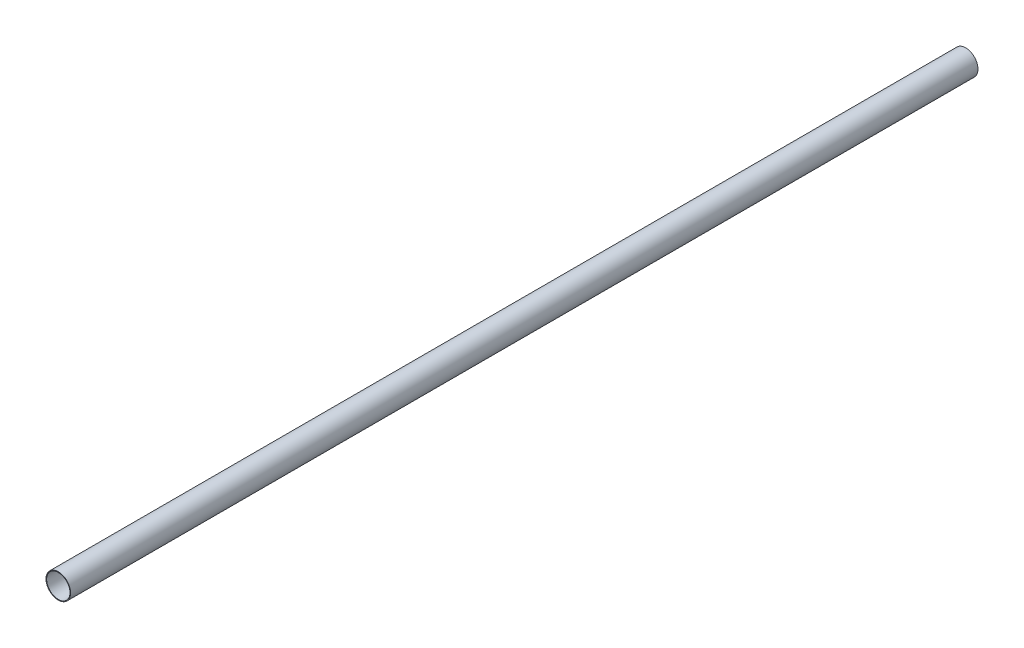
ISO-10303-21;
HEADER;
FILE_DESCRIPTION(('STEP AP214'),'2;1');
FILE_NAME('part.step','',(''),(''),'','','');
FILE_SCHEMA(('AUTOMOTIVE_DESIGN { 1 0 10303 214 1 1 1 1 }'));
ENDSEC;
DATA;
#1=APPLICATION_CONTEXT('core data for automotive mechanical design processes');
#2=APPLICATION_PROTOCOL_DEFINITION('international standard','automotive_design',2000,#1);
#3=PRODUCT_CONTEXT('',#1,'mechanical');
#4=PRODUCT('Part','Part','',(#3));
#5=PRODUCT_RELATED_PRODUCT_CATEGORY('part','',(#4));
#6=PRODUCT_DEFINITION_FORMATION('','',#4);
#7=PRODUCT_DEFINITION_CONTEXT('part definition',#1,'design');
#8=PRODUCT_DEFINITION('design','',#6,#7);
#9=PRODUCT_DEFINITION_SHAPE('','',#8);
#10=(LENGTH_UNIT() NAMED_UNIT(*) SI_UNIT(.MILLI.,.METRE.));
#11=(NAMED_UNIT(*) PLANE_ANGLE_UNIT() SI_UNIT($,.RADIAN.));
#12=(NAMED_UNIT(*) SI_UNIT($,.STERADIAN.) SOLID_ANGLE_UNIT());
#13=UNCERTAINTY_MEASURE_WITH_UNIT(LENGTH_MEASURE(1.E-05),#10,'distance_accuracy_value','');
#14=(GEOMETRIC_REPRESENTATION_CONTEXT(3) GLOBAL_UNCERTAINTY_ASSIGNED_CONTEXT((#13)) GLOBAL_UNIT_ASSIGNED_CONTEXT((#10,
#11,#12)) REPRESENTATION_CONTEXT('',''));
#15=CARTESIAN_POINT('',(0.,0.,0.));
#16=DIRECTION('',(0.,0.,1.));
#17=DIRECTION('',(1.,0.,0.));
#18=AXIS2_PLACEMENT_3D('',#15,#16,#17);
#19=CARTESIAN_POINT('',(0.,0.,829.));
#20=DIRECTION('',(0.,0.,1.));
#21=DIRECTION('',(1.,0.,0.));
#22=AXIS2_PLACEMENT_3D('',#19,#20,#21);
#23=PLANE('',#22);
#24=CARTESIAN_POINT('',(0.,0.,829.));
#25=DIRECTION('',(0.,0.,1.));
#26=DIRECTION('',(1.,0.,0.));
#27=AXIS2_PLACEMENT_3D('',#24,#25,#26);
#28=CIRCLE('',#27,11.25);
#29=CARTESIAN_POINT('',(11.25,0.,829.));
#30=VERTEX_POINT('',#29);
#31=EDGE_CURVE('E10',#30,#30,#28,.T.);
#32=ORIENTED_EDGE('',*,*,#31,.T.);
#33=EDGE_LOOP('',(#32));
#34=FACE_BOUND('',#33,.T.);
#35=CARTESIAN_POINT('',(0.,0.,829.));
#36=DIRECTION('',(0.,0.,1.));
#37=DIRECTION('',(1.,0.,0.));
#38=AXIS2_PLACEMENT_3D('',#35,#36,#37);
#39=CIRCLE('',#38,10.65);
#40=CARTESIAN_POINT('',(10.65,0.,829.));
#41=VERTEX_POINT('',#40);
#42=EDGE_CURVE('E41',#41,#41,#39,.T.);
#43=ORIENTED_EDGE('',*,*,#42,.F.);
#44=EDGE_LOOP('',(#43));
#45=FACE_BOUND('',#44,.T.);
#46=ADVANCED_FACE('F30',(#34,#45),#23,.T.);
#47=CARTESIAN_POINT('',(0.,0.,0.));
#48=DIRECTION('',(0.,0.,1.));
#49=DIRECTION('',(1.,0.,0.));
#50=AXIS2_PLACEMENT_3D('',#47,#48,#49);
#51=PLANE('',#50);
#52=CARTESIAN_POINT('',(0.,0.,0.));
#53=DIRECTION('',(0.,0.,1.));
#54=DIRECTION('',(1.,0.,0.));
#55=AXIS2_PLACEMENT_3D('',#52,#53,#54);
#56=CIRCLE('',#55,11.25);
#57=CARTESIAN_POINT('',(11.25,0.,0.));
#58=VERTEX_POINT('',#57);
#59=EDGE_CURVE('E34',#58,#58,#56,.T.);
#60=ORIENTED_EDGE('',*,*,#59,.F.);
#61=EDGE_LOOP('',(#60));
#62=FACE_BOUND('',#61,.T.);
#63=CARTESIAN_POINT('',(0.,0.,0.));
#64=DIRECTION('',(0.,0.,1.));
#65=DIRECTION('',(1.,0.,0.));
#66=AXIS2_PLACEMENT_3D('',#63,#64,#65);
#67=CIRCLE('',#66,10.65);
#68=CARTESIAN_POINT('',(10.65,0.,0.));
#69=VERTEX_POINT('',#68);
#70=EDGE_CURVE('E43',#69,#69,#67,.T.);
#71=ORIENTED_EDGE('',*,*,#70,.T.);
#72=EDGE_LOOP('',(#71));
#73=FACE_BOUND('',#72,.T.);
#74=ADVANCED_FACE('F53',(#62,#73),#51,.F.);
#75=CARTESIAN_POINT('',(0.,0.,829.));
#76=DIRECTION('',(0.,0.,-1.));
#77=DIRECTION('',(-1.,0.,0.));
#78=AXIS2_PLACEMENT_3D('',#75,#76,#77);
#79=CYLINDRICAL_SURFACE('',#78,11.25);
#80=ORIENTED_EDGE('',*,*,#31,.F.);
#81=EDGE_LOOP('',(#80));
#82=FACE_BOUND('',#81,.T.);
#83=ORIENTED_EDGE('',*,*,#59,.T.);
#84=EDGE_LOOP('',(#83));
#85=FACE_BOUND('',#84,.T.);
#86=ADVANCED_FACE('F32',(#82,#85),#79,.T.);
#87=CARTESIAN_POINT('',(0.,0.,829.));
#88=DIRECTION('',(0.,0.,-1.));
#89=DIRECTION('',(-1.,0.,0.));
#90=AXIS2_PLACEMENT_3D('',#87,#88,#89);
#91=CYLINDRICAL_SURFACE('',#90,10.65);
#92=ORIENTED_EDGE('',*,*,#42,.T.);
#93=EDGE_LOOP('',(#92));
#94=FACE_BOUND('',#93,.T.);
#95=ORIENTED_EDGE('',*,*,#70,.F.);
#96=EDGE_LOOP('',(#95));
#97=FACE_BOUND('',#96,.T.);
#98=ADVANCED_FACE('F49',(#94,#97),#91,.F.);
#99=CLOSED_SHELL('',(#46,#74,#86,#98));
#100=MANIFOLD_SOLID_BREP('B2',#99);
#101=ADVANCED_BREP_SHAPE_REPRESENTATION('',(#18,#100),#14);
#102=SHAPE_DEFINITION_REPRESENTATION(#9,#101);
ENDSEC;
END-ISO-10303-21;
